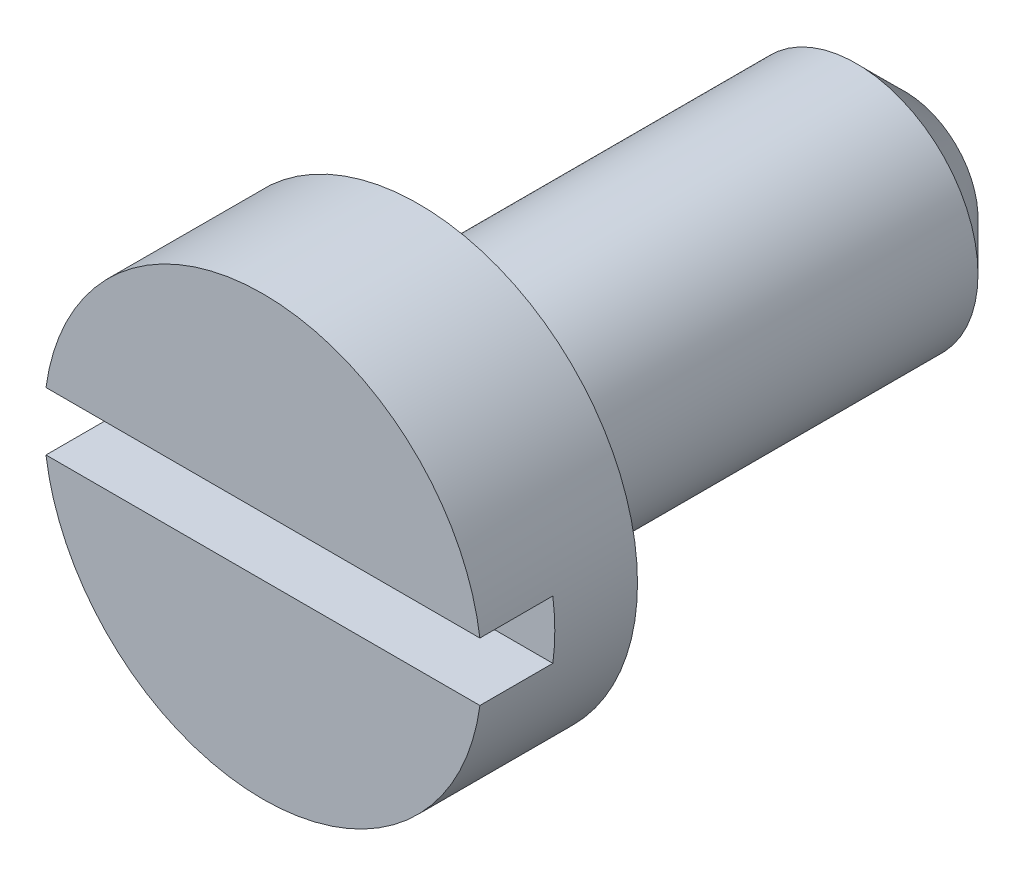
ISO-10303-21;
HEADER;
FILE_DESCRIPTION(('STEP AP214'),'2;1');
FILE_NAME('part.step','',(''),(''),'','','');
FILE_SCHEMA(('AUTOMOTIVE_DESIGN { 1 0 10303 214 1 1 1 1 }'));
ENDSEC;
DATA;
#1=APPLICATION_CONTEXT('core data for automotive mechanical design processes');
#2=APPLICATION_PROTOCOL_DEFINITION('international standard','automotive_design',2000,#1);
#3=PRODUCT_CONTEXT('',#1,'mechanical');
#4=PRODUCT('Part','Part','',(#3));
#5=PRODUCT_RELATED_PRODUCT_CATEGORY('part','',(#4));
#6=PRODUCT_DEFINITION_FORMATION('','',#4);
#7=PRODUCT_DEFINITION_CONTEXT('part definition',#1,'design');
#8=PRODUCT_DEFINITION('design','',#6,#7);
#9=PRODUCT_DEFINITION_SHAPE('','',#8);
#10=(LENGTH_UNIT() NAMED_UNIT(*) SI_UNIT(.MILLI.,.METRE.));
#11=(NAMED_UNIT(*) PLANE_ANGLE_UNIT() SI_UNIT($,.RADIAN.));
#12=(NAMED_UNIT(*) SI_UNIT($,.STERADIAN.) SOLID_ANGLE_UNIT());
#13=UNCERTAINTY_MEASURE_WITH_UNIT(LENGTH_MEASURE(1.E-05),#10,'distance_accuracy_value','');
#14=(GEOMETRIC_REPRESENTATION_CONTEXT(3) GLOBAL_UNCERTAINTY_ASSIGNED_CONTEXT((#13)) GLOBAL_UNIT_ASSIGNED_CONTEXT((#10,
#11,#12)) REPRESENTATION_CONTEXT('',''));
#15=CARTESIAN_POINT('',(0.,0.,0.));
#16=DIRECTION('',(0.,0.,1.));
#17=DIRECTION('',(1.,0.,0.));
#18=AXIS2_PLACEMENT_3D('',#15,#16,#17);
#19=CARTESIAN_POINT('',(0.,0.,1.6));
#20=DIRECTION('',(0.,0.,1.));
#21=DIRECTION('',(1.,0.,0.));
#22=AXIS2_PLACEMENT_3D('',#19,#20,#21);
#23=PLANE('',#22);
#24=DIRECTION('',(-1.,0.,0.));
#25=VECTOR('',#24,1.);
#26=CARTESIAN_POINT('',(0.,0.3,1.6));
#27=LINE('',#26,#25);
#28=CARTESIAN_POINT('',(2.22991031209778,0.3,1.6));
#29=VERTEX_POINT('',#28);
#30=CARTESIAN_POINT('',(-2.22991031209778,0.3,1.6));
#31=VERTEX_POINT('',#30);
#32=EDGE_CURVE('E77',#29,#31,#27,.T.);
#33=ORIENTED_EDGE('',*,*,#32,.F.);
#34=CARTESIAN_POINT('',(0.,0.,1.6));
#35=DIRECTION('',(0.,0.,1.));
#36=DIRECTION('',(1.,0.,0.));
#37=AXIS2_PLACEMENT_3D('',#34,#35,#36);
#38=CIRCLE('',#37,2.25);
#39=EDGE_CURVE('E90',#29,#31,#38,.T.);
#40=ORIENTED_EDGE('',*,*,#39,.T.);
#41=EDGE_LOOP('',(#33,#40));
#42=FACE_BOUND('',#41,.T.);
#43=ADVANCED_FACE('F29',(#42),#23,.T.);
#44=CARTESIAN_POINT('',(0.,0.,0.));
#45=DIRECTION('',(0.,0.,1.));
#46=DIRECTION('',(1.,0.,0.));
#47=AXIS2_PLACEMENT_3D('',#44,#45,#46);
#48=PLANE('',#47);
#49=CARTESIAN_POINT('',(0.,0.,0.));
#50=DIRECTION('',(0.,0.,1.));
#51=DIRECTION('',(1.,0.,0.));
#52=AXIS2_PLACEMENT_3D('',#49,#50,#51);
#53=CIRCLE('',#52,2.25);
#54=CARTESIAN_POINT('',(2.25,0.,0.));
#55=VERTEX_POINT('',#54);
#56=EDGE_CURVE('E91',#55,#55,#53,.T.);
#57=ORIENTED_EDGE('',*,*,#56,.F.);
#58=EDGE_LOOP('',(#57));
#59=FACE_BOUND('',#58,.T.);
#60=CARTESIAN_POINT('',(0.,0.,0.));
#61=DIRECTION('',(0.,0.,1.));
#62=DIRECTION('',(1.,0.,0.));
#63=AXIS2_PLACEMENT_3D('',#60,#61,#62);
#64=CIRCLE('',#63,1.25);
#65=CARTESIAN_POINT('',(1.25,0.,0.));
#66=VERTEX_POINT('',#65);
#67=EDGE_CURVE('E78',#66,#66,#64,.F.);
#68=ORIENTED_EDGE('',*,*,#67,.F.);
#69=EDGE_LOOP('',(#68));
#70=FACE_BOUND('',#69,.T.);
#71=ADVANCED_FACE('F118',(#59,#70),#48,.F.);
#72=CARTESIAN_POINT('',(0.,0.,1.6));
#73=DIRECTION('',(0.,0.,-1.));
#74=DIRECTION('',(-1.,0.,0.));
#75=AXIS2_PLACEMENT_3D('',#72,#73,#74);
#76=CYLINDRICAL_SURFACE('',#75,2.25);
#77=CARTESIAN_POINT('',(0.,0.,0.85));
#78=DIRECTION('',(0.,0.,1.));
#79=DIRECTION('',(1.,0.,0.));
#80=AXIS2_PLACEMENT_3D('',#77,#78,#79);
#81=CIRCLE('',#80,2.25);
#82=CARTESIAN_POINT('',(-2.22991031209778,0.3,0.85));
#83=VERTEX_POINT('',#82);
#84=CARTESIAN_POINT('',(-2.22991031209778,-0.3,0.85));
#85=VERTEX_POINT('',#84);
#86=EDGE_CURVE('E102',#83,#85,#81,.T.);
#87=ORIENTED_EDGE('',*,*,#86,.F.);
#88=DIRECTION('',(0.,0.,-1.));
#89=VECTOR('',#88,1.);
#90=CARTESIAN_POINT('',(-2.22991031209778,0.3,1.6));
#91=LINE('',#90,#89);
#92=EDGE_CURVE('E52',#83,#31,#91,.F.);
#93=ORIENTED_EDGE('',*,*,#92,.T.);
#94=ORIENTED_EDGE('',*,*,#39,.F.);
#95=DIRECTION('',(0.,0.,-1.));
#96=VECTOR('',#95,1.);
#97=CARTESIAN_POINT('',(2.22991031209778,0.3,1.6));
#98=LINE('',#97,#96);
#99=CARTESIAN_POINT('',(2.22991031209778,0.3,0.85));
#100=VERTEX_POINT('',#99);
#101=EDGE_CURVE('E95',#29,#100,#98,.T.);
#102=ORIENTED_EDGE('',*,*,#101,.T.);
#103=CARTESIAN_POINT('',(2.22991031209778,-0.3,0.85));
#104=VERTEX_POINT('',#103);
#105=EDGE_CURVE('E86',#104,#100,#81,.T.);
#106=ORIENTED_EDGE('',*,*,#105,.F.);
#107=DIRECTION('',(0.,0.,-1.));
#108=VECTOR('',#107,1.);
#109=CARTESIAN_POINT('',(2.22991031209778,-0.3,1.6));
#110=LINE('',#109,#108);
#111=CARTESIAN_POINT('',(2.22991031209778,-0.3,1.6));
#112=VERTEX_POINT('',#111);
#113=EDGE_CURVE('E72',#104,#112,#110,.F.);
#114=ORIENTED_EDGE('',*,*,#113,.T.);
#115=CARTESIAN_POINT('',(-2.22991031209778,-0.3,1.6));
#116=VERTEX_POINT('',#115);
#117=EDGE_CURVE('E84',#116,#112,#38,.T.);
#118=ORIENTED_EDGE('',*,*,#117,.F.);
#119=DIRECTION('',(0.,0.,-1.));
#120=VECTOR('',#119,1.);
#121=CARTESIAN_POINT('',(-2.22991031209778,-0.3,1.6));
#122=LINE('',#121,#120);
#123=EDGE_CURVE('E44',#116,#85,#122,.T.);
#124=ORIENTED_EDGE('',*,*,#123,.T.);
#125=EDGE_LOOP('',(#87,#93,#94,#102,#106,#114,#118,#124));
#126=FACE_BOUND('',#125,.T.);
#127=ORIENTED_EDGE('',*,*,#56,.T.);
#128=EDGE_LOOP('',(#127));
#129=FACE_BOUND('',#128,.T.);
#130=ADVANCED_FACE('F31',(#126,#129),#76,.T.);
#131=DIRECTION('',(1.,0.,0.));
#132=VECTOR('',#131,1.);
#133=CARTESIAN_POINT('',(0.,-0.3,1.6));
#134=LINE('',#133,#132);
#135=EDGE_CURVE('E69',#116,#112,#134,.T.);
#136=ORIENTED_EDGE('',*,*,#135,.F.);
#137=ORIENTED_EDGE('',*,*,#117,.T.);
#138=EDGE_LOOP('',(#136,#137));
#139=FACE_BOUND('',#138,.T.);
#140=ADVANCED_FACE('F89',(#139),#23,.T.);
#141=CARTESIAN_POINT('',(0.,0.,-5.));
#142=DIRECTION('',(0.,0.,1.));
#143=DIRECTION('',(1.,0.,0.));
#144=AXIS2_PLACEMENT_3D('',#141,#142,#143);
#145=CYLINDRICAL_SURFACE('',#144,1.25);
#146=CARTESIAN_POINT('',(0.,0.,-4.5));
#147=DIRECTION('',(0.,0.,-1.));
#148=DIRECTION('',(-1.,0.,0.));
#149=AXIS2_PLACEMENT_3D('',#146,#147,#148);
#150=CIRCLE('',#149,1.25);
#151=CARTESIAN_POINT('',(-1.25,0.,-4.5));
#152=VERTEX_POINT('',#151);
#153=EDGE_CURVE('E11',#152,#152,#150,.F.);
#154=ORIENTED_EDGE('',*,*,#153,.T.);
#155=EDGE_LOOP('',(#154));
#156=FACE_BOUND('',#155,.T.);
#157=ORIENTED_EDGE('',*,*,#67,.T.);
#158=EDGE_LOOP('',(#157));
#159=FACE_BOUND('',#158,.T.);
#160=ADVANCED_FACE('F126',(#156,#159),#145,.T.);
#161=CARTESIAN_POINT('',(0.,0.,-5.));
#162=DIRECTION('',(0.,0.,-1.));
#163=DIRECTION('',(-1.,0.,0.));
#164=AXIS2_PLACEMENT_3D('',#161,#162,#163);
#165=PLANE('',#164);
#166=CARTESIAN_POINT('',(0.,0.,-5.));
#167=DIRECTION('',(0.,0.,-1.));
#168=DIRECTION('',(-1.,0.,0.));
#169=AXIS2_PLACEMENT_3D('',#166,#167,#168);
#170=CIRCLE('',#169,0.750000000000001);
#171=CARTESIAN_POINT('',(-0.750000000000001,0.,-5.));
#172=VERTEX_POINT('',#171);
#173=EDGE_CURVE('E37',#172,#172,#170,.T.);
#174=ORIENTED_EDGE('',*,*,#173,.T.);
#175=EDGE_LOOP('',(#174));
#176=FACE_BOUND('',#175,.T.);
#177=ADVANCED_FACE('F131',(#176),#165,.T.);
#178=CARTESIAN_POINT('',(-2.66911764705882,-0.3,0.85));
#179=DIRECTION('',(0.,0.,1.));
#180=DIRECTION('',(1.,0.,0.));
#181=AXIS2_PLACEMENT_3D('',#178,#179,#180);
#182=PLANE('',#181);
#183=ORIENTED_EDGE('',*,*,#86,.T.);
#184=DIRECTION('',(1.,0.,0.));
#185=VECTOR('',#184,1.);
#186=CARTESIAN_POINT('',(-2.66911764705882,-0.3,0.85));
#187=LINE('',#186,#185);
#188=EDGE_CURVE('E108',#85,#104,#187,.T.);
#189=ORIENTED_EDGE('',*,*,#188,.T.);
#190=ORIENTED_EDGE('',*,*,#105,.T.);
#191=DIRECTION('',(-1.,0.,0.));
#192=VECTOR('',#191,1.);
#193=CARTESIAN_POINT('',(-2.66911764705882,0.3,0.85));
#194=LINE('',#193,#192);
#195=EDGE_CURVE('E87',#100,#83,#194,.T.);
#196=ORIENTED_EDGE('',*,*,#195,.T.);
#197=EDGE_LOOP('',(#183,#189,#190,#196));
#198=FACE_BOUND('',#197,.T.);
#199=ADVANCED_FACE('F107',(#198),#182,.T.);
#200=CARTESIAN_POINT('',(-2.66911764705882,0.3,0.85));
#201=DIRECTION('',(0.,1.,0.));
#202=DIRECTION('',(0.,0.,1.));
#203=AXIS2_PLACEMENT_3D('',#200,#201,#202);
#204=PLANE('',#203);
#205=ORIENTED_EDGE('',*,*,#32,.T.);
#206=ORIENTED_EDGE('',*,*,#92,.F.);
#207=ORIENTED_EDGE('',*,*,#195,.F.);
#208=ORIENTED_EDGE('',*,*,#101,.F.);
#209=EDGE_LOOP('',(#205,#206,#207,#208));
#210=FACE_BOUND('',#209,.T.);
#211=ADVANCED_FACE('F115',(#210),#204,.F.);
#212=CARTESIAN_POINT('',(-2.66911764705882,-0.3,0.85));
#213=DIRECTION('',(0.,-1.,0.));
#214=DIRECTION('',(0.,0.,-1.));
#215=AXIS2_PLACEMENT_3D('',#212,#213,#214);
#216=PLANE('',#215);
#217=ORIENTED_EDGE('',*,*,#135,.T.);
#218=ORIENTED_EDGE('',*,*,#113,.F.);
#219=ORIENTED_EDGE('',*,*,#188,.F.);
#220=ORIENTED_EDGE('',*,*,#123,.F.);
#221=EDGE_LOOP('',(#217,#218,#219,#220));
#222=FACE_BOUND('',#221,.T.);
#223=ADVANCED_FACE('F71',(#222),#216,.F.);
#224=CARTESIAN_POINT('',(0.,0.,-5.));
#225=DIRECTION('',(0.,0.,1.));
#226=DIRECTION('',(1.,0.,0.));
#227=AXIS2_PLACEMENT_3D('',#224,#225,#226);
#228=CONICAL_SURFACE('',#227,0.750000000000001,0.785398163397446);
#229=ORIENTED_EDGE('',*,*,#153,.F.);
#230=EDGE_LOOP('',(#229));
#231=FACE_BOUND('',#230,.T.);
#232=ORIENTED_EDGE('',*,*,#173,.F.);
#233=EDGE_LOOP('',(#232));
#234=FACE_BOUND('',#233,.T.);
#235=ADVANCED_FACE('F173',(#231,#234),#228,.T.);
#236=CLOSED_SHELL('',(#43,#71,#130,#140,#160,#177,#199,#211,#223,#235));
#237=MANIFOLD_SOLID_BREP('B2',#236);
#238=ADVANCED_BREP_SHAPE_REPRESENTATION('',(#18,#237),#14);
#239=SHAPE_DEFINITION_REPRESENTATION(#9,#238);
ENDSEC;
END-ISO-10303-21;
